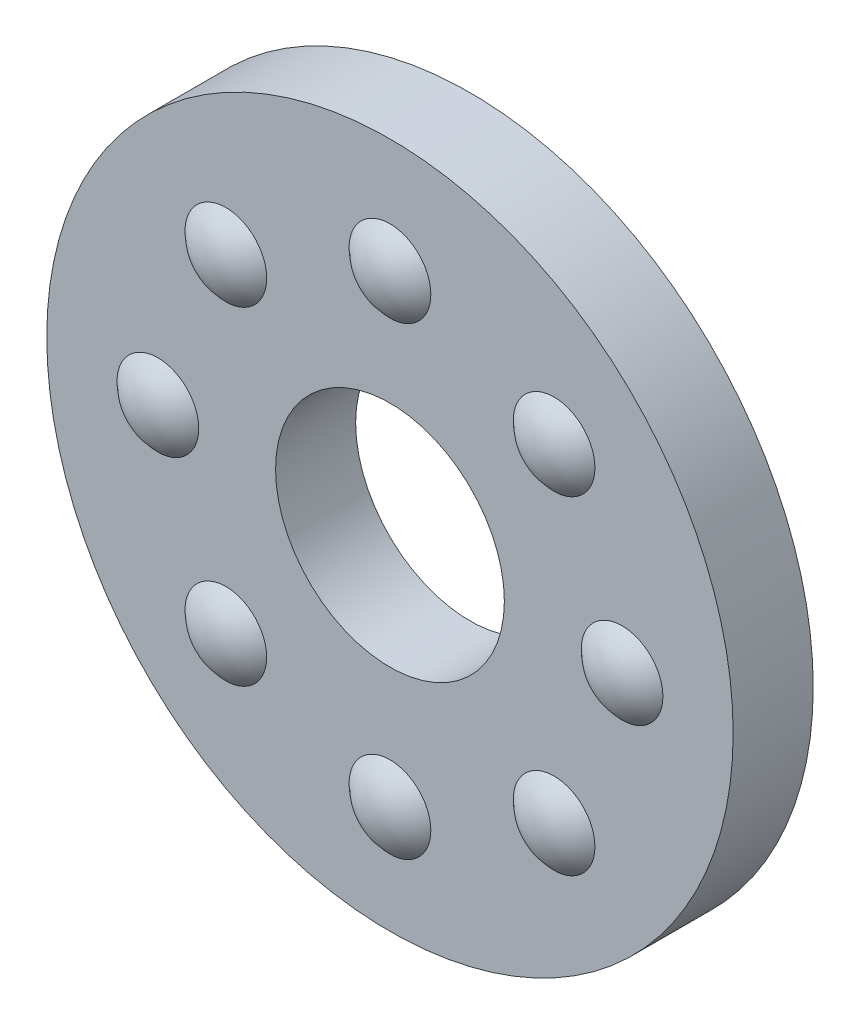
ISO-10303-21;
HEADER;
FILE_DESCRIPTION(('STEP AP214'),'2;1');
FILE_NAME('part.step','',(''),(''),'','','');
FILE_SCHEMA(('AUTOMOTIVE_DESIGN { 1 0 10303 214 1 1 1 1 }'));
ENDSEC;
DATA;
#1=APPLICATION_CONTEXT('core data for automotive mechanical design processes');
#2=APPLICATION_PROTOCOL_DEFINITION('international standard','automotive_design',2000,#1);
#3=PRODUCT_CONTEXT('',#1,'mechanical');
#4=PRODUCT('Part','Part','',(#3));
#5=PRODUCT_RELATED_PRODUCT_CATEGORY('part','',(#4));
#6=PRODUCT_DEFINITION_FORMATION('','',#4);
#7=PRODUCT_DEFINITION_CONTEXT('part definition',#1,'design');
#8=PRODUCT_DEFINITION('design','',#6,#7);
#9=PRODUCT_DEFINITION_SHAPE('','',#8);
#10=(LENGTH_UNIT() NAMED_UNIT(*) SI_UNIT(.MILLI.,.METRE.));
#11=(NAMED_UNIT(*) PLANE_ANGLE_UNIT() SI_UNIT($,.RADIAN.));
#12=(NAMED_UNIT(*) SI_UNIT($,.STERADIAN.) SOLID_ANGLE_UNIT());
#13=UNCERTAINTY_MEASURE_WITH_UNIT(LENGTH_MEASURE(1.E-05),#10,'distance_accuracy_value','');
#14=(GEOMETRIC_REPRESENTATION_CONTEXT(3) GLOBAL_UNCERTAINTY_ASSIGNED_CONTEXT((#13)) GLOBAL_UNIT_ASSIGNED_CONTEXT((#10,
#11,#12)) REPRESENTATION_CONTEXT('',''));
#15=CARTESIAN_POINT('',(0.,0.,0.));
#16=DIRECTION('',(0.,0.,1.));
#17=DIRECTION('',(1.,0.,0.));
#18=AXIS2_PLACEMENT_3D('',#15,#16,#17);
#19=CARTESIAN_POINT('',(0.,0.,0.7));
#20=DIRECTION('',(0.,0.,-1.));
#21=DIRECTION('',(-1.,0.,0.));
#22=AXIS2_PLACEMENT_3D('',#19,#20,#21);
#23=CYLINDRICAL_SURFACE('',#22,3.);
#24=CARTESIAN_POINT('',(0.,0.,0.7));
#25=DIRECTION('',(0.,0.,1.));
#26=DIRECTION('',(1.,0.,0.));
#27=AXIS2_PLACEMENT_3D('',#24,#25,#26);
#28=CIRCLE('',#27,3.);
#29=CARTESIAN_POINT('',(3.,0.,0.7));
#30=VERTEX_POINT('',#29);
#31=EDGE_CURVE('E69',#30,#30,#28,.T.);
#32=ORIENTED_EDGE('',*,*,#31,.F.);
#33=EDGE_LOOP('',(#32));
#34=FACE_BOUND('',#33,.T.);
#35=CARTESIAN_POINT('',(0.,0.,0.));
#36=DIRECTION('',(0.,0.,1.));
#37=DIRECTION('',(1.,0.,0.));
#38=AXIS2_PLACEMENT_3D('',#35,#36,#37);
#39=CIRCLE('',#38,3.);
#40=CARTESIAN_POINT('',(3.,0.,0.));
#41=VERTEX_POINT('',#40);
#42=EDGE_CURVE('E72',#41,#41,#39,.T.);
#43=ORIENTED_EDGE('',*,*,#42,.T.);
#44=EDGE_LOOP('',(#43));
#45=FACE_BOUND('',#44,.T.);
#46=ADVANCED_FACE('F35',(#34,#45),#23,.T.);
#47=CARTESIAN_POINT('',(0.,0.,0.7));
#48=DIRECTION('',(0.,0.,1.));
#49=DIRECTION('',(1.,0.,0.));
#50=AXIS2_PLACEMENT_3D('',#47,#48,#49);
#51=PLANE('',#50);
#52=CARTESIAN_POINT('',(0.,0.,0.7));
#53=DIRECTION('',(0.,0.,1.));
#54=DIRECTION('',(1.,0.,0.));
#55=AXIS2_PLACEMENT_3D('',#52,#53,#54);
#56=CIRCLE('',#55,1.);
#57=CARTESIAN_POINT('',(1.,0.,0.7));
#58=VERTEX_POINT('',#57);
#59=EDGE_CURVE('E50',#58,#58,#56,.T.);
#60=ORIENTED_EDGE('',*,*,#59,.F.);
#61=EDGE_LOOP('',(#60));
#62=FACE_BOUND('',#61,.T.);
#63=CARTESIAN_POINT('',(1.43453615794395,1.40579566766503,0.7));
#64=DIRECTION('',(0.,0.,1.));
#65=DIRECTION('',(1.,0.,0.));
#66=AXIS2_PLACEMENT_3D('',#63,#64,#65);
#67=CIRCLE('',#66,0.357071421427142);
#68=CARTESIAN_POINT('',(1.79160757937109,1.40579566766503,0.7));
#69=VERTEX_POINT('',#68);
#70=EDGE_CURVE('E10',#69,#69,#67,.T.);
#71=ORIENTED_EDGE('',*,*,#70,.F.);
#72=EDGE_LOOP('',(#71));
#73=FACE_BOUND('',#72,.T.);
#74=CARTESIAN_POINT('',(2.02874049027895,-0.0287404902789305,0.7));
#75=DIRECTION('',(0.,0.,1.));
#76=DIRECTION('',(1.,0.,0.));
#77=AXIS2_PLACEMENT_3D('',#74,#75,#76);
#78=CIRCLE('',#77,0.357071421427142);
#79=CARTESIAN_POINT('',(2.38581191170609,-0.0287404902789305,0.7));
#80=VERTEX_POINT('',#79);
#81=EDGE_CURVE('E42',#80,#80,#78,.T.);
#82=ORIENTED_EDGE('',*,*,#81,.F.);
#83=EDGE_LOOP('',(#82));
#84=FACE_BOUND('',#83,.T.);
#85=CARTESIAN_POINT('',(1.43453615794398,-1.46327664822291,0.7));
#86=DIRECTION('',(0.,0.,1.));
#87=DIRECTION('',(1.,0.,0.));
#88=AXIS2_PLACEMENT_3D('',#85,#86,#87);
#89=CIRCLE('',#88,0.357071421427142);
#90=CARTESIAN_POINT('',(1.79160757937112,-1.46327664822291,0.7));
#91=VERTEX_POINT('',#90);
#92=EDGE_CURVE('E47',#91,#91,#89,.T.);
#93=ORIENTED_EDGE('',*,*,#92,.F.);
#94=EDGE_LOOP('',(#93));
#95=FACE_BOUND('',#94,.T.);
#96=CARTESIAN_POINT('',(0.,-2.0574809805579,0.7));
#97=DIRECTION('',(0.,0.,1.));
#98=DIRECTION('',(1.,0.,0.));
#99=AXIS2_PLACEMENT_3D('',#96,#97,#98);
#100=CIRCLE('',#99,0.357071421427142);
#101=CARTESIAN_POINT('',(0.357071421427142,-2.0574809805579,0.7));
#102=VERTEX_POINT('',#101);
#103=EDGE_CURVE('E54',#102,#102,#100,.T.);
#104=ORIENTED_EDGE('',*,*,#103,.F.);
#105=EDGE_LOOP('',(#104));
#106=FACE_BOUND('',#105,.T.);
#107=CARTESIAN_POINT('',(-1.43453615794396,-1.46327664822293,0.7));
#108=DIRECTION('',(0.,0.,1.));
#109=DIRECTION('',(1.,0.,0.));
#110=AXIS2_PLACEMENT_3D('',#107,#108,#109);
#111=CIRCLE('',#110,0.357071421427142);
#112=CARTESIAN_POINT('',(-1.07746473651682,-1.46327664822293,0.7));
#113=VERTEX_POINT('',#112);
#114=EDGE_CURVE('E57',#113,#113,#111,.T.);
#115=ORIENTED_EDGE('',*,*,#114,.F.);
#116=EDGE_LOOP('',(#115));
#117=FACE_BOUND('',#116,.T.);
#118=CARTESIAN_POINT('',(-2.02874049027895,-0.0287404902789589,0.7));
#119=DIRECTION('',(0.,0.,1.));
#120=DIRECTION('',(1.,0.,0.));
#121=AXIS2_PLACEMENT_3D('',#118,#119,#120);
#122=CIRCLE('',#121,0.357071421427142);
#123=CARTESIAN_POINT('',(-1.67166906885181,-0.0287404902789589,0.7));
#124=VERTEX_POINT('',#123);
#125=EDGE_CURVE('E60',#124,#124,#122,.T.);
#126=ORIENTED_EDGE('',*,*,#125,.F.);
#127=EDGE_LOOP('',(#126));
#128=FACE_BOUND('',#127,.T.);
#129=CARTESIAN_POINT('',(-1.43453615794397,1.40579566766501,0.7));
#130=DIRECTION('',(0.,0.,1.));
#131=DIRECTION('',(1.,0.,0.));
#132=AXIS2_PLACEMENT_3D('',#129,#130,#131);
#133=CIRCLE('',#132,0.357071421427142);
#134=CARTESIAN_POINT('',(-1.07746473651683,1.40579566766501,0.7));
#135=VERTEX_POINT('',#134);
#136=EDGE_CURVE('E63',#135,#135,#133,.T.);
#137=ORIENTED_EDGE('',*,*,#136,.F.);
#138=EDGE_LOOP('',(#137));
#139=FACE_BOUND('',#138,.T.);
#140=CARTESIAN_POINT('',(0.,2.,0.7));
#141=DIRECTION('',(0.,0.,1.));
#142=DIRECTION('',(1.,0.,0.));
#143=AXIS2_PLACEMENT_3D('',#140,#141,#142);
#144=CIRCLE('',#143,0.357071421427142);
#145=CARTESIAN_POINT('',(0.357071421427142,2.,0.7));
#146=VERTEX_POINT('',#145);
#147=EDGE_CURVE('E66',#146,#146,#144,.T.);
#148=ORIENTED_EDGE('',*,*,#147,.F.);
#149=EDGE_LOOP('',(#148));
#150=FACE_BOUND('',#149,.T.);
#151=ORIENTED_EDGE('',*,*,#31,.T.);
#152=EDGE_LOOP('',(#151));
#153=FACE_BOUND('',#152,.T.);
#154=ADVANCED_FACE('F108',(#62,#73,#84,#95,#106,#117,#128,#139,#150,#153),#51,.T.);
#155=CARTESIAN_POINT('',(0.,0.,0.));
#156=DIRECTION('',(0.,0.,1.));
#157=DIRECTION('',(1.,0.,0.));
#158=AXIS2_PLACEMENT_3D('',#155,#156,#157);
#159=PLANE('',#158);
#160=CARTESIAN_POINT('',(0.,0.,0.));
#161=DIRECTION('',(0.,0.,1.));
#162=DIRECTION('',(1.,0.,0.));
#163=AXIS2_PLACEMENT_3D('',#160,#161,#162);
#164=CIRCLE('',#163,1.);
#165=CARTESIAN_POINT('',(1.,0.,0.));
#166=VERTEX_POINT('',#165);
#167=EDGE_CURVE('E38',#166,#166,#164,.T.);
#168=ORIENTED_EDGE('',*,*,#167,.T.);
#169=EDGE_LOOP('',(#168));
#170=FACE_BOUND('',#169,.T.);
#171=CARTESIAN_POINT('',(1.43453615794395,1.40579566766503,0.));
#172=DIRECTION('',(0.,0.,1.));
#173=DIRECTION('',(1.,0.,0.));
#174=AXIS2_PLACEMENT_3D('',#171,#172,#173);
#175=CIRCLE('',#174,0.357071421427142);
#176=CARTESIAN_POINT('',(1.79160757937109,1.40579566766503,0.));
#177=VERTEX_POINT('',#176);
#178=EDGE_CURVE('E95',#177,#177,#175,.T.);
#179=ORIENTED_EDGE('',*,*,#178,.T.);
#180=EDGE_LOOP('',(#179));
#181=FACE_BOUND('',#180,.T.);
#182=CARTESIAN_POINT('',(2.02874049027895,-0.0287404902789305,0.));
#183=DIRECTION('',(0.,0.,1.));
#184=DIRECTION('',(1.,0.,0.));
#185=AXIS2_PLACEMENT_3D('',#182,#183,#184);
#186=CIRCLE('',#185,0.357071421427142);
#187=CARTESIAN_POINT('',(2.38581191170609,-0.0287404902789305,0.));
#188=VERTEX_POINT('',#187);
#189=EDGE_CURVE('E93',#188,#188,#186,.T.);
#190=ORIENTED_EDGE('',*,*,#189,.T.);
#191=EDGE_LOOP('',(#190));
#192=FACE_BOUND('',#191,.T.);
#193=CARTESIAN_POINT('',(1.43453615794398,-1.46327664822291,0.));
#194=DIRECTION('',(0.,0.,1.));
#195=DIRECTION('',(1.,0.,0.));
#196=AXIS2_PLACEMENT_3D('',#193,#194,#195);
#197=CIRCLE('',#196,0.357071421427142);
#198=CARTESIAN_POINT('',(1.79160757937112,-1.46327664822291,0.));
#199=VERTEX_POINT('',#198);
#200=EDGE_CURVE('E90',#199,#199,#197,.T.);
#201=ORIENTED_EDGE('',*,*,#200,.T.);
#202=EDGE_LOOP('',(#201));
#203=FACE_BOUND('',#202,.T.);
#204=CARTESIAN_POINT('',(0.,-2.0574809805579,0.));
#205=DIRECTION('',(0.,0.,1.));
#206=DIRECTION('',(1.,0.,0.));
#207=AXIS2_PLACEMENT_3D('',#204,#205,#206);
#208=CIRCLE('',#207,0.357071421427142);
#209=CARTESIAN_POINT('',(0.357071421427142,-2.0574809805579,0.));
#210=VERTEX_POINT('',#209);
#211=EDGE_CURVE('E87',#210,#210,#208,.T.);
#212=ORIENTED_EDGE('',*,*,#211,.T.);
#213=EDGE_LOOP('',(#212));
#214=FACE_BOUND('',#213,.T.);
#215=CARTESIAN_POINT('',(-1.43453615794396,-1.46327664822293,0.));
#216=DIRECTION('',(0.,0.,1.));
#217=DIRECTION('',(1.,0.,0.));
#218=AXIS2_PLACEMENT_3D('',#215,#216,#217);
#219=CIRCLE('',#218,0.357071421427142);
#220=CARTESIAN_POINT('',(-1.07746473651682,-1.46327664822293,0.));
#221=VERTEX_POINT('',#220);
#222=EDGE_CURVE('E84',#221,#221,#219,.T.);
#223=ORIENTED_EDGE('',*,*,#222,.T.);
#224=EDGE_LOOP('',(#223));
#225=FACE_BOUND('',#224,.T.);
#226=CARTESIAN_POINT('',(-2.02874049027895,-0.0287404902789589,0.));
#227=DIRECTION('',(0.,0.,1.));
#228=DIRECTION('',(1.,0.,0.));
#229=AXIS2_PLACEMENT_3D('',#226,#227,#228);
#230=CIRCLE('',#229,0.357071421427142);
#231=CARTESIAN_POINT('',(-1.67166906885181,-0.0287404902789589,0.));
#232=VERTEX_POINT('',#231);
#233=EDGE_CURVE('E81',#232,#232,#230,.T.);
#234=ORIENTED_EDGE('',*,*,#233,.T.);
#235=EDGE_LOOP('',(#234));
#236=FACE_BOUND('',#235,.T.);
#237=CARTESIAN_POINT('',(-1.43453615794397,1.40579566766501,0.));
#238=DIRECTION('',(0.,0.,1.));
#239=DIRECTION('',(1.,0.,0.));
#240=AXIS2_PLACEMENT_3D('',#237,#238,#239);
#241=CIRCLE('',#240,0.357071421427142);
#242=CARTESIAN_POINT('',(-1.07746473651683,1.40579566766501,0.));
#243=VERTEX_POINT('',#242);
#244=EDGE_CURVE('E78',#243,#243,#241,.T.);
#245=ORIENTED_EDGE('',*,*,#244,.T.);
#246=EDGE_LOOP('',(#245));
#247=FACE_BOUND('',#246,.T.);
#248=CARTESIAN_POINT('',(0.,2.,0.));
#249=DIRECTION('',(0.,0.,1.));
#250=DIRECTION('',(1.,0.,0.));
#251=AXIS2_PLACEMENT_3D('',#248,#249,#250);
#252=CIRCLE('',#251,0.357071421427142);
#253=CARTESIAN_POINT('',(0.357071421427142,2.,0.));
#254=VERTEX_POINT('',#253);
#255=EDGE_CURVE('E75',#254,#254,#252,.T.);
#256=ORIENTED_EDGE('',*,*,#255,.T.);
#257=EDGE_LOOP('',(#256));
#258=FACE_BOUND('',#257,.T.);
#259=ORIENTED_EDGE('',*,*,#42,.F.);
#260=EDGE_LOOP('',(#259));
#261=FACE_BOUND('',#260,.T.);
#262=ADVANCED_FACE('F111',(#170,#181,#192,#203,#214,#225,#236,#247,#258,#261),#159,.F.);
#263=CARTESIAN_POINT('',(0.,2.,0.35));
#264=DIRECTION('',(0.,1.,0.));
#265=DIRECTION('',(1.,0.,0.));
#266=AXIS2_PLACEMENT_3D('',#263,#264,#265);
#267=SPHERICAL_SURFACE('',#266,0.5);
#268=CARTESIAN_POINT('',(0.,2.,0.35));
#269=DIRECTION('',(0.,0.,1.));
#270=DIRECTION('',(1.,0.,0.));
#271=AXIS2_PLACEMENT_3D('',#268,#269,#270);
#272=SPHERICAL_SURFACE('',#271,0.5);
#273=ORIENTED_EDGE('',*,*,#255,.F.);
#274=EDGE_LOOP('',(#273));
#275=FACE_BOUND('',#274,.T.);
#276=ADVANCED_FACE('F135',(#275),#272,.T.);
#277=CARTESIAN_POINT('',(0.,2.,0.35));
#278=DIRECTION('',(0.,0.,1.));
#279=DIRECTION('',(1.,0.,0.));
#280=AXIS2_PLACEMENT_3D('',#277,#278,#279);
#281=SPHERICAL_SURFACE('',#280,0.5);
#282=ORIENTED_EDGE('',*,*,#147,.T.);
#283=EDGE_LOOP('',(#282));
#284=FACE_BOUND('',#283,.T.);
#285=ADVANCED_FACE('F139',(#284),#281,.T.);
#286=CARTESIAN_POINT('',(-1.43453615794397,1.40579566766501,0.35));
#287=DIRECTION('',(-0.707106781186549,0.707106781186546,0.));
#288=DIRECTION('',(0.707106781186546,0.707106781186549,0.));
#289=AXIS2_PLACEMENT_3D('',#286,#287,#288);
#290=SPHERICAL_SURFACE('',#289,0.5);
#291=CARTESIAN_POINT('',(-1.43453615794397,1.40579566766501,0.35));
#292=DIRECTION('',(0.,0.,1.));
#293=DIRECTION('',(1.,0.,0.));
#294=AXIS2_PLACEMENT_3D('',#291,#292,#293);
#295=SPHERICAL_SURFACE('',#294,0.5);
#296=ORIENTED_EDGE('',*,*,#244,.F.);
#297=EDGE_LOOP('',(#296));
#298=FACE_BOUND('',#297,.T.);
#299=ADVANCED_FACE('F144',(#298),#295,.T.);
#300=CARTESIAN_POINT('',(-1.43453615794397,1.40579566766501,0.35));
#301=DIRECTION('',(0.,0.,1.));
#302=DIRECTION('',(1.,0.,0.));
#303=AXIS2_PLACEMENT_3D('',#300,#301,#302);
#304=SPHERICAL_SURFACE('',#303,0.5);
#305=ORIENTED_EDGE('',*,*,#136,.T.);
#306=EDGE_LOOP('',(#305));
#307=FACE_BOUND('',#306,.T.);
#308=ADVANCED_FACE('F146',(#307),#304,.T.);
#309=CARTESIAN_POINT('',(-2.02874049027895,-0.0287404902789589,0.35));
#310=DIRECTION('',(-1.,0.,0.));
#311=DIRECTION('',(0.,1.,0.));
#312=AXIS2_PLACEMENT_3D('',#309,#310,#311);
#313=SPHERICAL_SURFACE('',#312,0.5);
#314=CARTESIAN_POINT('',(-2.02874049027895,-0.0287404902789589,0.35));
#315=DIRECTION('',(0.,0.,1.));
#316=DIRECTION('',(1.,0.,0.));
#317=AXIS2_PLACEMENT_3D('',#314,#315,#316);
#318=SPHERICAL_SURFACE('',#317,0.5);
#319=ORIENTED_EDGE('',*,*,#233,.F.);
#320=EDGE_LOOP('',(#319));
#321=FACE_BOUND('',#320,.T.);
#322=ADVANCED_FACE('F149',(#321),#318,.T.);
#323=CARTESIAN_POINT('',(-2.02874049027895,-0.0287404902789589,0.35));
#324=DIRECTION('',(0.,0.,1.));
#325=DIRECTION('',(1.,0.,0.));
#326=AXIS2_PLACEMENT_3D('',#323,#324,#325);
#327=SPHERICAL_SURFACE('',#326,0.5);
#328=ORIENTED_EDGE('',*,*,#125,.T.);
#329=EDGE_LOOP('',(#328));
#330=FACE_BOUND('',#329,.T.);
#331=ADVANCED_FACE('F151',(#330),#327,.T.);
#332=CARTESIAN_POINT('',(-1.43453615794396,-1.46327664822293,0.35));
#333=DIRECTION('',(-0.707106781186544,-0.707106781186551,0.));
#334=DIRECTION('',(-0.707106781186551,0.707106781186544,0.));
#335=AXIS2_PLACEMENT_3D('',#332,#333,#334);
#336=SPHERICAL_SURFACE('',#335,0.5);
#337=CARTESIAN_POINT('',(-1.43453615794396,-1.46327664822293,0.35));
#338=DIRECTION('',(0.,0.,1.));
#339=DIRECTION('',(1.,0.,0.));
#340=AXIS2_PLACEMENT_3D('',#337,#338,#339);
#341=SPHERICAL_SURFACE('',#340,0.5);
#342=ORIENTED_EDGE('',*,*,#222,.F.);
#343=EDGE_LOOP('',(#342));
#344=FACE_BOUND('',#343,.T.);
#345=ADVANCED_FACE('F154',(#344),#341,.T.);
#346=CARTESIAN_POINT('',(-1.43453615794396,-1.46327664822293,0.35));
#347=DIRECTION('',(0.,0.,1.));
#348=DIRECTION('',(1.,0.,0.));
#349=AXIS2_PLACEMENT_3D('',#346,#347,#348);
#350=SPHERICAL_SURFACE('',#349,0.5);
#351=ORIENTED_EDGE('',*,*,#114,.T.);
#352=EDGE_LOOP('',(#351));
#353=FACE_BOUND('',#352,.T.);
#354=ADVANCED_FACE('F156',(#353),#350,.T.);
#355=CARTESIAN_POINT('',(0.,-2.0574809805579,0.35));
#356=DIRECTION('',(0.,-1.,0.));
#357=DIRECTION('',(-1.,0.,0.));
#358=AXIS2_PLACEMENT_3D('',#355,#356,#357);
#359=SPHERICAL_SURFACE('',#358,0.5);
#360=CARTESIAN_POINT('',(0.,-2.0574809805579,0.35));
#361=DIRECTION('',(0.,0.,1.));
#362=DIRECTION('',(1.,0.,0.));
#363=AXIS2_PLACEMENT_3D('',#360,#361,#362);
#364=SPHERICAL_SURFACE('',#363,0.5);
#365=ORIENTED_EDGE('',*,*,#211,.F.);
#366=EDGE_LOOP('',(#365));
#367=FACE_BOUND('',#366,.T.);
#368=ADVANCED_FACE('F159',(#367),#364,.T.);
#369=CARTESIAN_POINT('',(0.,-2.0574809805579,0.35));
#370=DIRECTION('',(0.,0.,1.));
#371=DIRECTION('',(1.,0.,0.));
#372=AXIS2_PLACEMENT_3D('',#369,#370,#371);
#373=SPHERICAL_SURFACE('',#372,0.5);
#374=ORIENTED_EDGE('',*,*,#103,.T.);
#375=EDGE_LOOP('',(#374));
#376=FACE_BOUND('',#375,.T.);
#377=ADVANCED_FACE('F161',(#376),#373,.T.);
#378=CARTESIAN_POINT('',(1.43453615794398,-1.46327664822291,0.35));
#379=DIRECTION('',(0.707106781186554,-0.707106781186541,0.));
#380=DIRECTION('',(-0.707106781186541,-0.707106781186554,0.));
#381=AXIS2_PLACEMENT_3D('',#378,#379,#380);
#382=SPHERICAL_SURFACE('',#381,0.5);
#383=CARTESIAN_POINT('',(1.43453615794398,-1.46327664822291,0.35));
#384=DIRECTION('',(0.,0.,1.));
#385=DIRECTION('',(1.,0.,0.));
#386=AXIS2_PLACEMENT_3D('',#383,#384,#385);
#387=SPHERICAL_SURFACE('',#386,0.5);
#388=ORIENTED_EDGE('',*,*,#200,.F.);
#389=EDGE_LOOP('',(#388));
#390=FACE_BOUND('',#389,.T.);
#391=ADVANCED_FACE('F164',(#390),#387,.T.);
#392=CARTESIAN_POINT('',(1.43453615794398,-1.46327664822291,0.35));
#393=DIRECTION('',(0.,0.,1.));
#394=DIRECTION('',(1.,0.,0.));
#395=AXIS2_PLACEMENT_3D('',#392,#393,#394);
#396=SPHERICAL_SURFACE('',#395,0.5);
#397=ORIENTED_EDGE('',*,*,#92,.T.);
#398=EDGE_LOOP('',(#397));
#399=FACE_BOUND('',#398,.T.);
#400=ADVANCED_FACE('F166',(#399),#396,.T.);
#401=CARTESIAN_POINT('',(2.02874049027895,-0.0287404902789305,0.35));
#402=DIRECTION('',(1.,0.,0.));
#403=DIRECTION('',(0.,-1.,0.));
#404=AXIS2_PLACEMENT_3D('',#401,#402,#403);
#405=SPHERICAL_SURFACE('',#404,0.5);
#406=CARTESIAN_POINT('',(2.02874049027895,-0.0287404902789305,0.35));
#407=DIRECTION('',(0.,0.,1.));
#408=DIRECTION('',(1.,0.,0.));
#409=AXIS2_PLACEMENT_3D('',#406,#407,#408);
#410=SPHERICAL_SURFACE('',#409,0.5);
#411=ORIENTED_EDGE('',*,*,#189,.F.);
#412=EDGE_LOOP('',(#411));
#413=FACE_BOUND('',#412,.T.);
#414=ADVANCED_FACE('F169',(#413),#410,.T.);
#415=CARTESIAN_POINT('',(2.02874049027895,-0.0287404902789305,0.35));
#416=DIRECTION('',(0.,0.,1.));
#417=DIRECTION('',(1.,0.,0.));
#418=AXIS2_PLACEMENT_3D('',#415,#416,#417);
#419=SPHERICAL_SURFACE('',#418,0.5);
#420=ORIENTED_EDGE('',*,*,#81,.T.);
#421=EDGE_LOOP('',(#420));
#422=FACE_BOUND('',#421,.T.);
#423=ADVANCED_FACE('F171',(#422),#419,.T.);
#424=CARTESIAN_POINT('',(1.43453615794395,1.40579566766503,0.35));
#425=DIRECTION('',(0.707106781186539,0.707106781186556,0.));
#426=DIRECTION('',(0.707106781186556,-0.707106781186539,0.));
#427=AXIS2_PLACEMENT_3D('',#424,#425,#426);
#428=SPHERICAL_SURFACE('',#427,0.5);
#429=CARTESIAN_POINT('',(1.43453615794395,1.40579566766503,0.35));
#430=DIRECTION('',(0.,0.,1.));
#431=DIRECTION('',(1.,0.,0.));
#432=AXIS2_PLACEMENT_3D('',#429,#430,#431);
#433=SPHERICAL_SURFACE('',#432,0.5);
#434=ORIENTED_EDGE('',*,*,#178,.F.);
#435=EDGE_LOOP('',(#434));
#436=FACE_BOUND('',#435,.T.);
#437=ADVANCED_FACE('F174',(#436),#433,.T.);
#438=CARTESIAN_POINT('',(1.43453615794395,1.40579566766503,0.35));
#439=DIRECTION('',(0.,0.,1.));
#440=DIRECTION('',(1.,0.,0.));
#441=AXIS2_PLACEMENT_3D('',#438,#439,#440);
#442=SPHERICAL_SURFACE('',#441,0.5);
#443=ORIENTED_EDGE('',*,*,#70,.T.);
#444=EDGE_LOOP('',(#443));
#445=FACE_BOUND('',#444,.T.);
#446=ADVANCED_FACE('F176',(#445),#442,.T.);
#447=CARTESIAN_POINT('',(0.,0.,-0.15));
#448=DIRECTION('',(0.,0.,1.));
#449=DIRECTION('',(1.,0.,0.));
#450=AXIS2_PLACEMENT_3D('',#447,#448,#449);
#451=CYLINDRICAL_SURFACE('',#450,1.);
#452=ORIENTED_EDGE('',*,*,#59,.T.);
#453=EDGE_LOOP('',(#452));
#454=FACE_BOUND('',#453,.T.);
#455=ORIENTED_EDGE('',*,*,#167,.F.);
#456=EDGE_LOOP('',(#455));
#457=FACE_BOUND('',#456,.T.);
#458=ADVANCED_FACE('F105',(#454,#457),#451,.F.);
#459=CLOSED_SHELL('',(#46,#154,#262,#276,#285,#299,#308,#322,#331,#345,#354,#368,#377,#391,#400,
#414,#423,#437,#446,#458));
#460=MANIFOLD_SOLID_BREP('B2',#459);
#461=ADVANCED_BREP_SHAPE_REPRESENTATION('',(#18,#460),#14);
#462=SHAPE_DEFINITION_REPRESENTATION(#9,#461);
ENDSEC;
END-ISO-10303-21;
